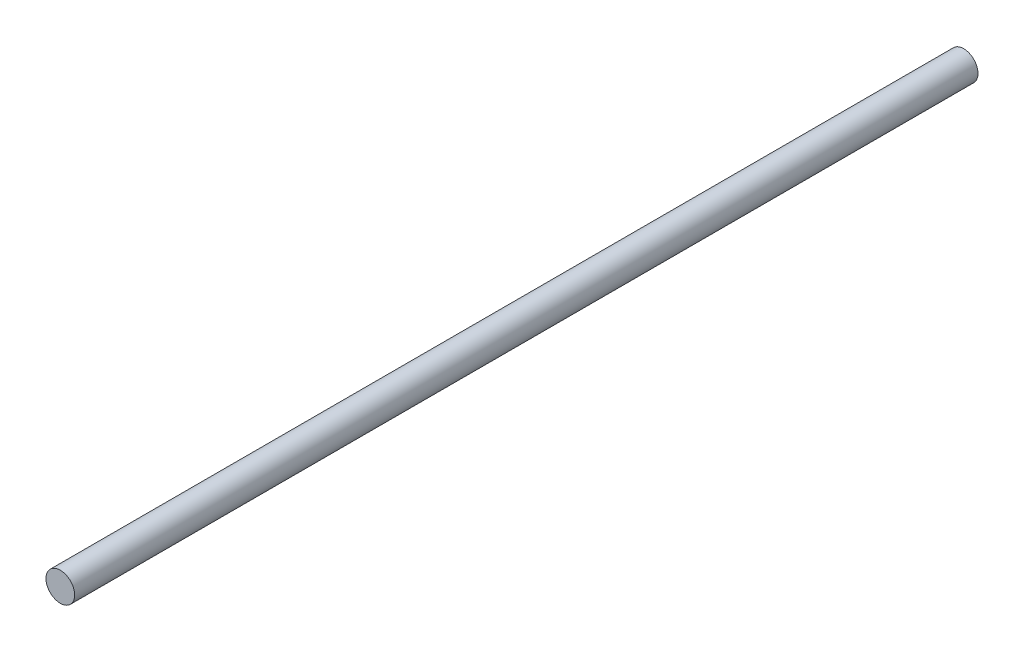
ISO-10303-21;
HEADER;
FILE_DESCRIPTION(('STEP AP214'),'2;1');
FILE_NAME('part.step','',(''),(''),'','','');
FILE_SCHEMA(('AUTOMOTIVE_DESIGN { 1 0 10303 214 1 1 1 1 }'));
ENDSEC;
DATA;
#1=APPLICATION_CONTEXT('core data for automotive mechanical design processes');
#2=APPLICATION_PROTOCOL_DEFINITION('international standard','automotive_design',2000,#1);
#3=PRODUCT_CONTEXT('',#1,'mechanical');
#4=PRODUCT('Part','Part','',(#3));
#5=PRODUCT_RELATED_PRODUCT_CATEGORY('part','',(#4));
#6=PRODUCT_DEFINITION_FORMATION('','',#4);
#7=PRODUCT_DEFINITION_CONTEXT('part definition',#1,'design');
#8=PRODUCT_DEFINITION('design','',#6,#7);
#9=PRODUCT_DEFINITION_SHAPE('','',#8);
#10=(LENGTH_UNIT() NAMED_UNIT(*) SI_UNIT(.MILLI.,.METRE.));
#11=(NAMED_UNIT(*) PLANE_ANGLE_UNIT() SI_UNIT($,.RADIAN.));
#12=(NAMED_UNIT(*) SI_UNIT($,.STERADIAN.) SOLID_ANGLE_UNIT());
#13=UNCERTAINTY_MEASURE_WITH_UNIT(LENGTH_MEASURE(1.E-05),#10,'distance_accuracy_value','');
#14=(GEOMETRIC_REPRESENTATION_CONTEXT(3) GLOBAL_UNCERTAINTY_ASSIGNED_CONTEXT((#13)) GLOBAL_UNIT_ASSIGNED_CONTEXT((#10,
#11,#12)) REPRESENTATION_CONTEXT('',''));
#15=CARTESIAN_POINT('',(0.,0.,0.));
#16=DIRECTION('',(0.,0.,1.));
#17=DIRECTION('',(1.,0.,0.));
#18=AXIS2_PLACEMENT_3D('',#15,#16,#17);
#19=CARTESIAN_POINT('',(0.,0.,50.));
#20=DIRECTION('',(0.,0.,-1.));
#21=DIRECTION('',(-1.,0.,0.));
#22=AXIS2_PLACEMENT_3D('',#19,#20,#21);
#23=CYLINDRICAL_SURFACE('',#22,1.5875);
#24=CARTESIAN_POINT('',(0.,0.,50.));
#25=DIRECTION('',(0.,0.,1.));
#26=DIRECTION('',(1.,0.,0.));
#27=AXIS2_PLACEMENT_3D('',#24,#25,#26);
#28=CIRCLE('',#27,1.5875);
#29=CARTESIAN_POINT('',(1.5875,0.,50.));
#30=VERTEX_POINT('',#29);
#31=EDGE_CURVE('E10',#30,#30,#28,.T.);
#32=ORIENTED_EDGE('',*,*,#31,.F.);
#33=EDGE_LOOP('',(#32));
#34=FACE_BOUND('',#33,.T.);
#35=CARTESIAN_POINT('',(0.,0.,-50.));
#36=DIRECTION('',(0.,0.,1.));
#37=DIRECTION('',(1.,0.,0.));
#38=AXIS2_PLACEMENT_3D('',#35,#36,#37);
#39=CIRCLE('',#38,1.5875);
#40=CARTESIAN_POINT('',(1.5875,0.,-50.));
#41=VERTEX_POINT('',#40);
#42=EDGE_CURVE('E34',#41,#41,#39,.T.);
#43=ORIENTED_EDGE('',*,*,#42,.T.);
#44=EDGE_LOOP('',(#43));
#45=FACE_BOUND('',#44,.T.);
#46=ADVANCED_FACE('F31',(#34,#45),#23,.T.);
#47=CARTESIAN_POINT('',(0.,0.,50.));
#48=DIRECTION('',(0.,0.,1.));
#49=DIRECTION('',(1.,0.,0.));
#50=AXIS2_PLACEMENT_3D('',#47,#48,#49);
#51=PLANE('',#50);
#52=ORIENTED_EDGE('',*,*,#31,.T.);
#53=EDGE_LOOP('',(#52));
#54=FACE_BOUND('',#53,.T.);
#55=ADVANCED_FACE('F46',(#54),#51,.T.);
#56=CARTESIAN_POINT('',(0.,0.,-50.));
#57=DIRECTION('',(0.,0.,1.));
#58=DIRECTION('',(1.,0.,0.));
#59=AXIS2_PLACEMENT_3D('',#56,#57,#58);
#60=PLANE('',#59);
#61=ORIENTED_EDGE('',*,*,#42,.F.);
#62=EDGE_LOOP('',(#61));
#63=FACE_BOUND('',#62,.T.);
#64=ADVANCED_FACE('F44',(#63),#60,.F.);
#65=CLOSED_SHELL('',(#46,#55,#64));
#66=MANIFOLD_SOLID_BREP('B2',#65);
#67=ADVANCED_BREP_SHAPE_REPRESENTATION('',(#18,#66),#14);
#68=SHAPE_DEFINITION_REPRESENTATION(#9,#67);
ENDSEC;
END-ISO-10303-21;
